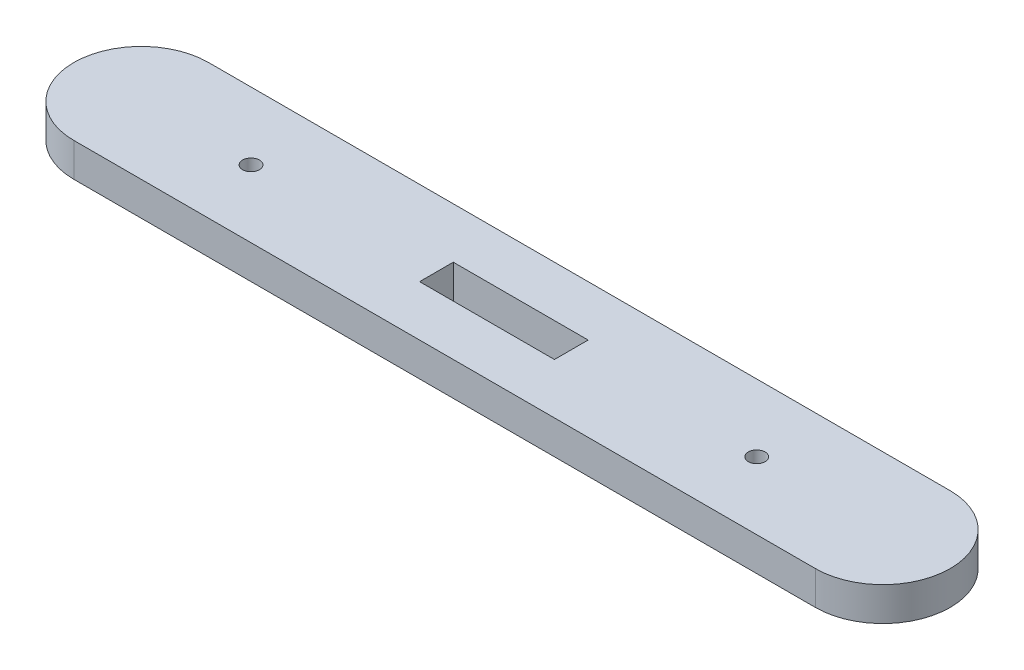
ISO-10303-21;
HEADER;
FILE_DESCRIPTION(('STEP AP214'),'2;1');
FILE_NAME('part.step','',(''),(''),'','','');
FILE_SCHEMA(('AUTOMOTIVE_DESIGN { 1 0 10303 214 1 1 1 1 }'));
ENDSEC;
DATA;
#1=APPLICATION_CONTEXT('core data for automotive mechanical design processes');
#2=APPLICATION_PROTOCOL_DEFINITION('international standard','automotive_design',2000,#1);
#3=PRODUCT_CONTEXT('',#1,'mechanical');
#4=PRODUCT('Part','Part','',(#3));
#5=PRODUCT_RELATED_PRODUCT_CATEGORY('part','',(#4));
#6=PRODUCT_DEFINITION_FORMATION('','',#4);
#7=PRODUCT_DEFINITION_CONTEXT('part definition',#1,'design');
#8=PRODUCT_DEFINITION('design','',#6,#7);
#9=PRODUCT_DEFINITION_SHAPE('','',#8);
#10=(LENGTH_UNIT() NAMED_UNIT(*) SI_UNIT(.MILLI.,.METRE.));
#11=(NAMED_UNIT(*) PLANE_ANGLE_UNIT() SI_UNIT($,.RADIAN.));
#12=(NAMED_UNIT(*) SI_UNIT($,.STERADIAN.) SOLID_ANGLE_UNIT());
#13=UNCERTAINTY_MEASURE_WITH_UNIT(LENGTH_MEASURE(1.E-05),#10,'distance_accuracy_value','');
#14=(GEOMETRIC_REPRESENTATION_CONTEXT(3) GLOBAL_UNCERTAINTY_ASSIGNED_CONTEXT((#13)) GLOBAL_UNIT_ASSIGNED_CONTEXT((#10,
#11,#12)) REPRESENTATION_CONTEXT('',''));
#15=CARTESIAN_POINT('',(0.,0.,0.));
#16=DIRECTION('',(0.,0.,1.));
#17=DIRECTION('',(1.,0.,0.));
#18=AXIS2_PLACEMENT_3D('',#15,#16,#17);
#19=CARTESIAN_POINT('',(72.3351876920608,6.35,36.8259630732655));
#20=DIRECTION('',(0.,1.,0.));
#21=DIRECTION('',(0.,0.,1.));
#22=AXIS2_PLACEMENT_3D('',#19,#20,#21);
#23=PLANE('',#22);
#24=CARTESIAN_POINT('',(-46.6724125074018,6.35,36.8259630732655));
#25=DIRECTION('',(0.,1.,0.));
#26=DIRECTION('',(0.,0.,1.));
#27=AXIS2_PLACEMENT_3D('',#24,#25,#26);
#28=CIRCLE('',#27,1.58750000000007);
#29=CARTESIAN_POINT('',(-46.6724125074018,6.35,38.4134630732655));
#30=VERTEX_POINT('',#29);
#31=EDGE_CURVE('E126',#30,#30,#28,.T.);
#32=ORIENTED_EDGE('',*,*,#31,.F.);
#33=EDGE_LOOP('',(#32));
#34=FACE_BOUND('',#33,.T.);
#35=CARTESIAN_POINT('',(72.3351876920608,6.35,36.8259630732655));
#36=DIRECTION('',(0.,1.,0.));
#37=DIRECTION('',(0.,0.,1.));
#38=AXIS2_PLACEMENT_3D('',#35,#36,#37);
#39=CIRCLE('',#38,12.7);
#40=CARTESIAN_POINT('',(72.3351876920608,6.35,49.5259630732655));
#41=VERTEX_POINT('',#40);
#42=CARTESIAN_POINT('',(72.3351876920608,6.35,24.1259630732655));
#43=VERTEX_POINT('',#42);
#44=EDGE_CURVE('E136',#41,#43,#39,.T.);
#45=ORIENTED_EDGE('',*,*,#44,.T.);
#46=DIRECTION('',(-1.,0.,0.));
#47=VECTOR('',#46,1.);
#48=CARTESIAN_POINT('',(72.3351876920608,6.35,24.1259630732655));
#49=LINE('',#48,#47);
#50=CARTESIAN_POINT('',(-67.3648123079391,6.35,24.1259630732655));
#51=VERTEX_POINT('',#50);
#52=EDGE_CURVE('E139',#43,#51,#49,.T.);
#53=ORIENTED_EDGE('',*,*,#52,.T.);
#54=CARTESIAN_POINT('',(-67.3648123079391,6.35,36.8259630732655));
#55=DIRECTION('',(0.,1.,0.));
#56=DIRECTION('',(0.,0.,1.));
#57=AXIS2_PLACEMENT_3D('',#54,#55,#56);
#58=CIRCLE('',#57,12.7);
#59=CARTESIAN_POINT('',(-67.3648123079391,6.35,49.5259630732654));
#60=VERTEX_POINT('',#59);
#61=EDGE_CURVE('E142',#51,#60,#58,.T.);
#62=ORIENTED_EDGE('',*,*,#61,.T.);
#63=DIRECTION('',(1.,0.,0.));
#64=VECTOR('',#63,1.);
#65=CARTESIAN_POINT('',(-67.3648123079391,6.35,49.5259630732654));
#66=LINE('',#65,#64);
#67=EDGE_CURVE('E144',#60,#41,#66,.T.);
#68=ORIENTED_EDGE('',*,*,#67,.T.);
#69=EDGE_LOOP('',(#45,#53,#62,#68));
#70=FACE_BOUND('',#69,.T.);
#71=DIRECTION('',(1.,0.,0.));
#72=VECTOR('',#71,1.);
#73=CARTESIAN_POINT('',(-11.747412507402,6.35,40.0009630732655));
#74=LINE('',#73,#72);
#75=CARTESIAN_POINT('',(-11.747412507402,6.35,40.0009630732655));
#76=VERTEX_POINT('',#75);
#77=CARTESIAN_POINT('',(13.6525874925981,6.35,40.0009630732655));
#78=VERTEX_POINT('',#77);
#79=EDGE_CURVE('E105',#76,#78,#74,.T.);
#80=ORIENTED_EDGE('',*,*,#79,.F.);
#81=DIRECTION('',(0.,0.,1.));
#82=VECTOR('',#81,1.);
#83=CARTESIAN_POINT('',(-11.747412507402,6.35,33.6509630732655));
#84=LINE('',#83,#82);
#85=CARTESIAN_POINT('',(-11.747412507402,6.35,33.6509630732655));
#86=VERTEX_POINT('',#85);
#87=EDGE_CURVE('E97',#86,#76,#84,.T.);
#88=ORIENTED_EDGE('',*,*,#87,.F.);
#89=DIRECTION('',(-1.,0.,0.));
#90=VECTOR('',#89,1.);
#91=CARTESIAN_POINT('',(-11.747412507402,6.35,33.6509630732655));
#92=LINE('',#91,#90);
#93=CARTESIAN_POINT('',(13.6525874925981,6.35,33.6509630732655));
#94=VERTEX_POINT('',#93);
#95=EDGE_CURVE('E120',#94,#86,#92,.T.);
#96=ORIENTED_EDGE('',*,*,#95,.F.);
#97=DIRECTION('',(0.,0.,-1.));
#98=VECTOR('',#97,1.);
#99=CARTESIAN_POINT('',(13.6525874925981,6.35,33.6509630732655));
#100=LINE('',#99,#98);
#101=EDGE_CURVE('E118',#78,#94,#100,.T.);
#102=ORIENTED_EDGE('',*,*,#101,.F.);
#103=EDGE_LOOP('',(#80,#88,#96,#102));
#104=FACE_BOUND('',#103,.T.);
#105=CARTESIAN_POINT('',(48.5775874925982,6.35,36.8259630732655));
#106=DIRECTION('',(0.,1.,0.));
#107=DIRECTION('',(0.,0.,1.));
#108=AXIS2_PLACEMENT_3D('',#105,#106,#107);
#109=CIRCLE('',#108,1.58750000000007);
#110=CARTESIAN_POINT('',(48.5775874925982,6.35,38.4134630732655));
#111=VERTEX_POINT('',#110);
#112=EDGE_CURVE('E226',#111,#111,#109,.T.);
#113=ORIENTED_EDGE('',*,*,#112,.F.);
#114=EDGE_LOOP('',(#113));
#115=FACE_BOUND('',#114,.T.);
#116=ADVANCED_FACE('F32',(#34,#70,#104,#115),#23,.T.);
#117=CARTESIAN_POINT('',(72.3351876920608,0.,36.8259630732655));
#118=DIRECTION('',(0.,1.,0.));
#119=DIRECTION('',(0.,0.,1.));
#120=AXIS2_PLACEMENT_3D('',#117,#118,#119);
#121=PLANE('',#120);
#122=CARTESIAN_POINT('',(72.3351876920608,0.,36.8259630732655));
#123=DIRECTION('',(0.,1.,0.));
#124=DIRECTION('',(0.,0.,1.));
#125=AXIS2_PLACEMENT_3D('',#122,#123,#124);
#126=CIRCLE('',#125,12.7);
#127=CARTESIAN_POINT('',(72.3351876920608,0.,49.5259630732655));
#128=VERTEX_POINT('',#127);
#129=CARTESIAN_POINT('',(72.3351876920608,0.,24.1259630732655));
#130=VERTEX_POINT('',#129);
#131=EDGE_CURVE('E113',#128,#130,#126,.T.);
#132=ORIENTED_EDGE('',*,*,#131,.F.);
#133=DIRECTION('',(1.,0.,0.));
#134=VECTOR('',#133,1.);
#135=CARTESIAN_POINT('',(-67.3648123079391,0.,49.5259630732654));
#136=LINE('',#135,#134);
#137=CARTESIAN_POINT('',(-67.3648123079391,0.,49.5259630732654));
#138=VERTEX_POINT('',#137);
#139=EDGE_CURVE('E140',#138,#128,#136,.T.);
#140=ORIENTED_EDGE('',*,*,#139,.F.);
#141=CARTESIAN_POINT('',(-67.3648123079391,0.,36.8259630732655));
#142=DIRECTION('',(0.,1.,0.));
#143=DIRECTION('',(0.,0.,1.));
#144=AXIS2_PLACEMENT_3D('',#141,#142,#143);
#145=CIRCLE('',#144,12.7);
#146=CARTESIAN_POINT('',(-67.3648123079391,0.,24.1259630732655));
#147=VERTEX_POINT('',#146);
#148=EDGE_CURVE('E151',#147,#138,#145,.T.);
#149=ORIENTED_EDGE('',*,*,#148,.F.);
#150=DIRECTION('',(-1.,0.,0.));
#151=VECTOR('',#150,1.);
#152=CARTESIAN_POINT('',(72.3351876920608,0.,24.1259630732655));
#153=LINE('',#152,#151);
#154=EDGE_CURVE('E149',#130,#147,#153,.T.);
#155=ORIENTED_EDGE('',*,*,#154,.F.);
#156=EDGE_LOOP('',(#132,#140,#149,#155));
#157=FACE_BOUND('',#156,.T.);
#158=DIRECTION('',(0.,0.,1.));
#159=VECTOR('',#158,1.);
#160=CARTESIAN_POINT('',(-11.747412507402,0.,33.6509630732655));
#161=LINE('',#160,#159);
#162=CARTESIAN_POINT('',(-11.747412507402,0.,33.6509630732655));
#163=VERTEX_POINT('',#162);
#164=CARTESIAN_POINT('',(-11.747412507402,0.,40.0009630732655));
#165=VERTEX_POINT('',#164);
#166=EDGE_CURVE('E55',#163,#165,#161,.T.);
#167=ORIENTED_EDGE('',*,*,#166,.T.);
#168=DIRECTION('',(1.,0.,0.));
#169=VECTOR('',#168,1.);
#170=CARTESIAN_POINT('',(-11.747412507402,0.,40.0009630732655));
#171=LINE('',#170,#169);
#172=CARTESIAN_POINT('',(13.6525874925981,0.,40.0009630732655));
#173=VERTEX_POINT('',#172);
#174=EDGE_CURVE('E112',#165,#173,#171,.T.);
#175=ORIENTED_EDGE('',*,*,#174,.T.);
#176=DIRECTION('',(0.,0.,-1.));
#177=VECTOR('',#176,1.);
#178=CARTESIAN_POINT('',(13.6525874925981,0.,33.6509630732655));
#179=LINE('',#178,#177);
#180=CARTESIAN_POINT('',(13.6525874925981,0.,33.6509630732655));
#181=VERTEX_POINT('',#180);
#182=EDGE_CURVE('E128',#173,#181,#179,.T.);
#183=ORIENTED_EDGE('',*,*,#182,.T.);
#184=DIRECTION('',(-1.,0.,0.));
#185=VECTOR('',#184,1.);
#186=CARTESIAN_POINT('',(-11.747412507402,0.,33.6509630732655));
#187=LINE('',#186,#185);
#188=EDGE_CURVE('E106',#181,#163,#187,.T.);
#189=ORIENTED_EDGE('',*,*,#188,.T.);
#190=EDGE_LOOP('',(#167,#175,#183,#189));
#191=FACE_BOUND('',#190,.T.);
#192=CARTESIAN_POINT('',(-46.6724125074018,0.,36.8259630732655));
#193=DIRECTION('',(0.,1.,0.));
#194=DIRECTION('',(0.,0.,1.));
#195=AXIS2_PLACEMENT_3D('',#192,#193,#194);
#196=CIRCLE('',#195,1.58750000000007);
#197=CARTESIAN_POINT('',(-46.6724125074018,0.,38.4134630732655));
#198=VERTEX_POINT('',#197);
#199=EDGE_CURVE('E232',#198,#198,#196,.T.);
#200=ORIENTED_EDGE('',*,*,#199,.T.);
#201=EDGE_LOOP('',(#200));
#202=FACE_BOUND('',#201,.T.);
#203=CARTESIAN_POINT('',(48.5775874925982,0.,36.8259630732655));
#204=DIRECTION('',(0.,1.,0.));
#205=DIRECTION('',(0.,0.,1.));
#206=AXIS2_PLACEMENT_3D('',#203,#204,#205);
#207=CIRCLE('',#206,1.58750000000007);
#208=CARTESIAN_POINT('',(48.5775874925982,0.,38.4134630732655));
#209=VERTEX_POINT('',#208);
#210=EDGE_CURVE('E229',#209,#209,#207,.T.);
#211=ORIENTED_EDGE('',*,*,#210,.T.);
#212=EDGE_LOOP('',(#211));
#213=FACE_BOUND('',#212,.T.);
#214=ADVANCED_FACE('F169',(#157,#191,#202,#213),#121,.F.);
#215=CARTESIAN_POINT('',(72.3351876920608,6.35,36.8259630732655));
#216=DIRECTION('',(0.,-1.,0.));
#217=DIRECTION('',(0.,0.,-1.));
#218=AXIS2_PLACEMENT_3D('',#215,#216,#217);
#219=CYLINDRICAL_SURFACE('',#218,12.7);
#220=ORIENTED_EDGE('',*,*,#131,.T.);
#221=DIRECTION('',(0.,-1.,0.));
#222=VECTOR('',#221,1.);
#223=CARTESIAN_POINT('',(72.3351876920608,6.35,24.1259630732655));
#224=LINE('',#223,#222);
#225=EDGE_CURVE('E11',#43,#130,#224,.T.);
#226=ORIENTED_EDGE('',*,*,#225,.F.);
#227=ORIENTED_EDGE('',*,*,#44,.F.);
#228=DIRECTION('',(0.,-1.,0.));
#229=VECTOR('',#228,1.);
#230=CARTESIAN_POINT('',(72.3351876920608,6.35,49.5259630732655));
#231=LINE('',#230,#229);
#232=EDGE_CURVE('E146',#41,#128,#231,.T.);
#233=ORIENTED_EDGE('',*,*,#232,.T.);
#234=EDGE_LOOP('',(#220,#226,#227,#233));
#235=FACE_BOUND('',#234,.T.);
#236=ADVANCED_FACE('F34',(#235),#219,.T.);
#237=CARTESIAN_POINT('',(72.3351876920608,6.35,24.1259630732655));
#238=DIRECTION('',(0.,0.,1.));
#239=DIRECTION('',(1.,0.,0.));
#240=AXIS2_PLACEMENT_3D('',#237,#238,#239);
#241=PLANE('',#240);
#242=ORIENTED_EDGE('',*,*,#154,.T.);
#243=DIRECTION('',(0.,-1.,0.));
#244=VECTOR('',#243,1.);
#245=CARTESIAN_POINT('',(-67.3648123079391,6.35,24.1259630732655));
#246=LINE('',#245,#244);
#247=EDGE_CURVE('E40',#51,#147,#246,.T.);
#248=ORIENTED_EDGE('',*,*,#247,.F.);
#249=ORIENTED_EDGE('',*,*,#52,.F.);
#250=ORIENTED_EDGE('',*,*,#225,.T.);
#251=EDGE_LOOP('',(#242,#248,#249,#250));
#252=FACE_BOUND('',#251,.T.);
#253=ADVANCED_FACE('F179',(#252),#241,.F.);
#254=CARTESIAN_POINT('',(-67.3648123079391,6.35,36.8259630732655));
#255=DIRECTION('',(0.,-1.,0.));
#256=DIRECTION('',(0.,0.,-1.));
#257=AXIS2_PLACEMENT_3D('',#254,#255,#256);
#258=CYLINDRICAL_SURFACE('',#257,12.7);
#259=ORIENTED_EDGE('',*,*,#148,.T.);
#260=DIRECTION('',(0.,-1.,0.));
#261=VECTOR('',#260,1.);
#262=CARTESIAN_POINT('',(-67.3648123079391,6.35,49.5259630732654));
#263=LINE('',#262,#261);
#264=EDGE_CURVE('E156',#60,#138,#263,.T.);
#265=ORIENTED_EDGE('',*,*,#264,.F.);
#266=ORIENTED_EDGE('',*,*,#61,.F.);
#267=ORIENTED_EDGE('',*,*,#247,.T.);
#268=EDGE_LOOP('',(#259,#265,#266,#267));
#269=FACE_BOUND('',#268,.T.);
#270=ADVANCED_FACE('F163',(#269),#258,.T.);
#271=CARTESIAN_POINT('',(-67.3648123079391,6.35,49.5259630732654));
#272=DIRECTION('',(0.,0.,-1.));
#273=DIRECTION('',(-1.,0.,0.));
#274=AXIS2_PLACEMENT_3D('',#271,#272,#273);
#275=PLANE('',#274);
#276=ORIENTED_EDGE('',*,*,#139,.T.);
#277=ORIENTED_EDGE('',*,*,#232,.F.);
#278=ORIENTED_EDGE('',*,*,#67,.F.);
#279=ORIENTED_EDGE('',*,*,#264,.T.);
#280=EDGE_LOOP('',(#276,#277,#278,#279));
#281=FACE_BOUND('',#280,.T.);
#282=ADVANCED_FACE('F173',(#281),#275,.F.);
#283=CARTESIAN_POINT('',(-11.747412507402,6.35,33.6509630732655));
#284=DIRECTION('',(1.,0.,0.));
#285=DIRECTION('',(0.,0.,-1.));
#286=AXIS2_PLACEMENT_3D('',#283,#284,#285);
#287=PLANE('',#286);
#288=ORIENTED_EDGE('',*,*,#166,.F.);
#289=DIRECTION('',(0.,-1.,0.));
#290=VECTOR('',#289,1.);
#291=CARTESIAN_POINT('',(-11.747412507402,6.35,33.6509630732655));
#292=LINE('',#291,#290);
#293=EDGE_CURVE('E101',#86,#163,#292,.T.);
#294=ORIENTED_EDGE('',*,*,#293,.F.);
#295=ORIENTED_EDGE('',*,*,#87,.T.);
#296=DIRECTION('',(0.,-1.,0.));
#297=VECTOR('',#296,1.);
#298=CARTESIAN_POINT('',(-11.747412507402,6.35,40.0009630732655));
#299=LINE('',#298,#297);
#300=EDGE_CURVE('E100',#76,#165,#299,.T.);
#301=ORIENTED_EDGE('',*,*,#300,.T.);
#302=EDGE_LOOP('',(#288,#294,#295,#301));
#303=FACE_BOUND('',#302,.T.);
#304=ADVANCED_FACE('F99',(#303),#287,.T.);
#305=CARTESIAN_POINT('',(-11.747412507402,6.35,40.0009630732655));
#306=DIRECTION('',(0.,0.,-1.));
#307=DIRECTION('',(-1.,0.,0.));
#308=AXIS2_PLACEMENT_3D('',#305,#306,#307);
#309=PLANE('',#308);
#310=ORIENTED_EDGE('',*,*,#174,.F.);
#311=ORIENTED_EDGE('',*,*,#300,.F.);
#312=ORIENTED_EDGE('',*,*,#79,.T.);
#313=DIRECTION('',(0.,-1.,0.));
#314=VECTOR('',#313,1.);
#315=CARTESIAN_POINT('',(13.6525874925981,6.35,40.0009630732655));
#316=LINE('',#315,#314);
#317=EDGE_CURVE('E114',#78,#173,#316,.T.);
#318=ORIENTED_EDGE('',*,*,#317,.T.);
#319=EDGE_LOOP('',(#310,#311,#312,#318));
#320=FACE_BOUND('',#319,.T.);
#321=ADVANCED_FACE('F109',(#320),#309,.T.);
#322=CARTESIAN_POINT('',(13.6525874925981,6.35,33.6509630732655));
#323=DIRECTION('',(-1.,0.,0.));
#324=DIRECTION('',(0.,0.,1.));
#325=AXIS2_PLACEMENT_3D('',#322,#323,#324);
#326=PLANE('',#325);
#327=ORIENTED_EDGE('',*,*,#182,.F.);
#328=ORIENTED_EDGE('',*,*,#317,.F.);
#329=ORIENTED_EDGE('',*,*,#101,.T.);
#330=DIRECTION('',(0.,-1.,0.));
#331=VECTOR('',#330,1.);
#332=CARTESIAN_POINT('',(13.6525874925981,6.35,33.6509630732655));
#333=LINE('',#332,#331);
#334=EDGE_CURVE('E47',#94,#181,#333,.T.);
#335=ORIENTED_EDGE('',*,*,#334,.T.);
#336=EDGE_LOOP('',(#327,#328,#329,#335));
#337=FACE_BOUND('',#336,.T.);
#338=ADVANCED_FACE('F204',(#337),#326,.T.);
#339=CARTESIAN_POINT('',(-11.747412507402,6.35,33.6509630732655));
#340=DIRECTION('',(0.,0.,1.));
#341=DIRECTION('',(1.,0.,0.));
#342=AXIS2_PLACEMENT_3D('',#339,#340,#341);
#343=PLANE('',#342);
#344=ORIENTED_EDGE('',*,*,#188,.F.);
#345=ORIENTED_EDGE('',*,*,#334,.F.);
#346=ORIENTED_EDGE('',*,*,#95,.T.);
#347=ORIENTED_EDGE('',*,*,#293,.T.);
#348=EDGE_LOOP('',(#344,#345,#346,#347));
#349=FACE_BOUND('',#348,.T.);
#350=ADVANCED_FACE('F208',(#349),#343,.T.);
#351=CARTESIAN_POINT('',(-46.6724125074018,6.35,36.8259630732655));
#352=DIRECTION('',(0.,-1.,0.));
#353=DIRECTION('',(0.,0.,-1.));
#354=AXIS2_PLACEMENT_3D('',#351,#352,#353);
#355=CYLINDRICAL_SURFACE('',#354,1.58750000000007);
#356=ORIENTED_EDGE('',*,*,#31,.T.);
#357=EDGE_LOOP('',(#356));
#358=FACE_BOUND('',#357,.T.);
#359=ORIENTED_EDGE('',*,*,#199,.F.);
#360=EDGE_LOOP('',(#359));
#361=FACE_BOUND('',#360,.T.);
#362=ADVANCED_FACE('F214',(#358,#361),#355,.F.);
#363=CARTESIAN_POINT('',(48.5775874925982,6.35,36.8259630732655));
#364=DIRECTION('',(0.,-1.,0.));
#365=DIRECTION('',(0.,0.,-1.));
#366=AXIS2_PLACEMENT_3D('',#363,#364,#365);
#367=CYLINDRICAL_SURFACE('',#366,1.58750000000007);
#368=ORIENTED_EDGE('',*,*,#112,.T.);
#369=EDGE_LOOP('',(#368));
#370=FACE_BOUND('',#369,.T.);
#371=ORIENTED_EDGE('',*,*,#210,.F.);
#372=EDGE_LOOP('',(#371));
#373=FACE_BOUND('',#372,.T.);
#374=ADVANCED_FACE('F217',(#370,#373),#367,.F.);
#375=CLOSED_SHELL('',(#116,#214,#236,#253,#270,#282,#304,#321,#338,#350,#362,#374));
#376=MANIFOLD_SOLID_BREP('B2',#375);
#377=ADVANCED_BREP_SHAPE_REPRESENTATION('',(#18,#376),#14);
#378=SHAPE_DEFINITION_REPRESENTATION(#9,#377);
ENDSEC;
END-ISO-10303-21;
